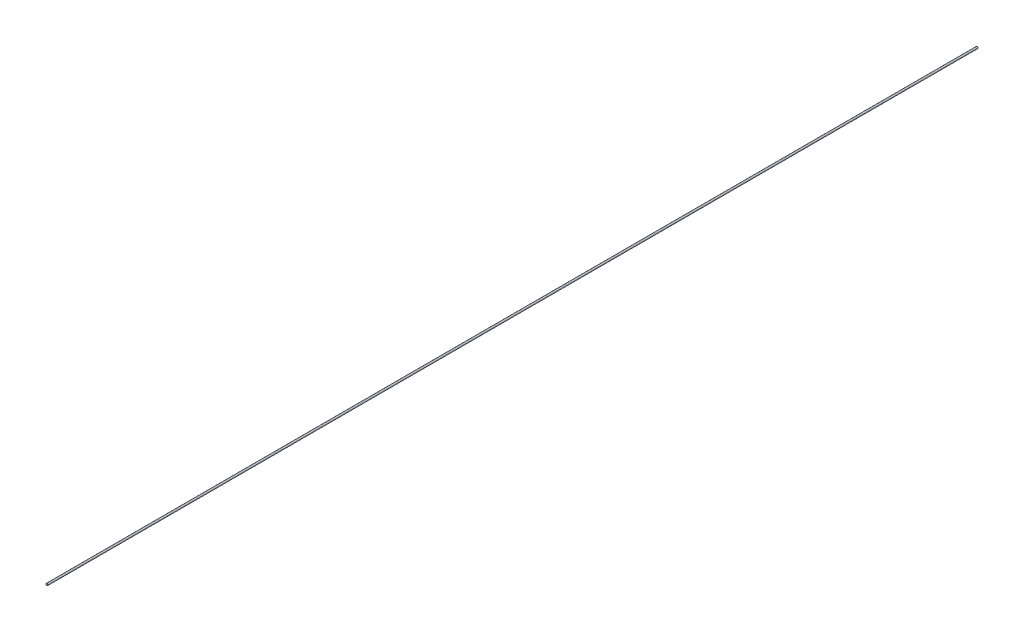
ISO-10303-21;
HEADER;
FILE_DESCRIPTION(('STEP AP214'),'2;1');
FILE_NAME('part.step','',(''),(''),'','','');
FILE_SCHEMA(('AUTOMOTIVE_DESIGN { 1 0 10303 214 1 1 1 1 }'));
ENDSEC;
DATA;
#1=APPLICATION_CONTEXT('core data for automotive mechanical design processes');
#2=APPLICATION_PROTOCOL_DEFINITION('international standard','automotive_design',2000,#1);
#3=PRODUCT_CONTEXT('',#1,'mechanical');
#4=PRODUCT('Part','Part','',(#3));
#5=PRODUCT_RELATED_PRODUCT_CATEGORY('part','',(#4));
#6=PRODUCT_DEFINITION_FORMATION('','',#4);
#7=PRODUCT_DEFINITION_CONTEXT('part definition',#1,'design');
#8=PRODUCT_DEFINITION('design','',#6,#7);
#9=PRODUCT_DEFINITION_SHAPE('','',#8);
#10=(LENGTH_UNIT() NAMED_UNIT(*) SI_UNIT(.MILLI.,.METRE.));
#11=(NAMED_UNIT(*) PLANE_ANGLE_UNIT() SI_UNIT($,.RADIAN.));
#12=(NAMED_UNIT(*) SI_UNIT($,.STERADIAN.) SOLID_ANGLE_UNIT());
#13=UNCERTAINTY_MEASURE_WITH_UNIT(LENGTH_MEASURE(1.E-05),#10,'distance_accuracy_value','');
#14=(GEOMETRIC_REPRESENTATION_CONTEXT(3) GLOBAL_UNCERTAINTY_ASSIGNED_CONTEXT((#13)) GLOBAL_UNIT_ASSIGNED_CONTEXT((#10,
#11,#12)) REPRESENTATION_CONTEXT('',''));
#15=CARTESIAN_POINT('',(0.,0.,0.));
#16=DIRECTION('',(0.,0.,1.));
#17=DIRECTION('',(1.,0.,0.));
#18=AXIS2_PLACEMENT_3D('',#15,#16,#17);
#19=CARTESIAN_POINT('',(0.,0.,40.));
#20=DIRECTION('',(0.,0.,-1.));
#21=DIRECTION('',(-1.,0.,0.));
#22=AXIS2_PLACEMENT_3D('',#19,#20,#21);
#23=CYLINDRICAL_SURFACE('',#22,0.04);
#24=CARTESIAN_POINT('',(0.,0.,40.));
#25=DIRECTION('',(0.,0.,1.));
#26=DIRECTION('',(1.,0.,0.));
#27=AXIS2_PLACEMENT_3D('',#24,#25,#26);
#28=CIRCLE('',#27,0.04);
#29=CARTESIAN_POINT('',(0.04,0.,40.));
#30=VERTEX_POINT('',#29);
#31=EDGE_CURVE('E10',#30,#30,#28,.T.);
#32=ORIENTED_EDGE('',*,*,#31,.F.);
#33=EDGE_LOOP('',(#32));
#34=FACE_BOUND('',#33,.T.);
#35=CARTESIAN_POINT('',(0.,0.,0.));
#36=DIRECTION('',(0.,0.,1.));
#37=DIRECTION('',(1.,0.,0.));
#38=AXIS2_PLACEMENT_3D('',#35,#36,#37);
#39=CIRCLE('',#38,0.04);
#40=CARTESIAN_POINT('',(0.04,0.,0.));
#41=VERTEX_POINT('',#40);
#42=EDGE_CURVE('E33',#41,#41,#39,.T.);
#43=ORIENTED_EDGE('',*,*,#42,.T.);
#44=EDGE_LOOP('',(#43));
#45=FACE_BOUND('',#44,.T.);
#46=ADVANCED_FACE('F30',(#34,#45),#23,.T.);
#47=CARTESIAN_POINT('',(0.,0.,40.));
#48=DIRECTION('',(0.,0.,1.));
#49=DIRECTION('',(1.,0.,0.));
#50=AXIS2_PLACEMENT_3D('',#47,#48,#49);
#51=PLANE('',#50);
#52=ORIENTED_EDGE('',*,*,#31,.T.);
#53=EDGE_LOOP('',(#52));
#54=FACE_BOUND('',#53,.T.);
#55=ADVANCED_FACE('F45',(#54),#51,.T.);
#56=CARTESIAN_POINT('',(0.,0.,0.));
#57=DIRECTION('',(0.,0.,1.));
#58=DIRECTION('',(1.,0.,0.));
#59=AXIS2_PLACEMENT_3D('',#56,#57,#58);
#60=PLANE('',#59);
#61=ORIENTED_EDGE('',*,*,#42,.F.);
#62=EDGE_LOOP('',(#61));
#63=FACE_BOUND('',#62,.T.);
#64=ADVANCED_FACE('F43',(#63),#60,.F.);
#65=CLOSED_SHELL('',(#46,#55,#64));
#66=MANIFOLD_SOLID_BREP('B2',#65);
#67=ADVANCED_BREP_SHAPE_REPRESENTATION('',(#18,#66),#14);
#68=SHAPE_DEFINITION_REPRESENTATION(#9,#67);
ENDSEC;
END-ISO-10303-21;
